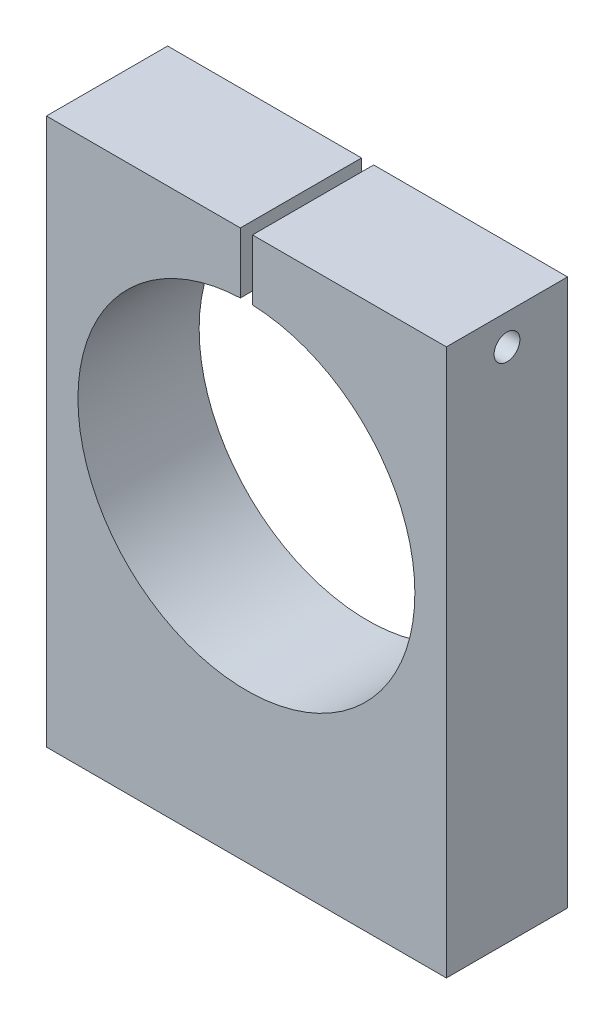
ISO-10303-21;
HEADER;
FILE_DESCRIPTION(('STEP AP214'),'2;1');
FILE_NAME('part.step','',(''),(''),'','','');
FILE_SCHEMA(('AUTOMOTIVE_DESIGN { 1 0 10303 214 1 1 1 1 }'));
ENDSEC;
DATA;
#1=APPLICATION_CONTEXT('core data for automotive mechanical design processes');
#2=APPLICATION_PROTOCOL_DEFINITION('international standard','automotive_design',2000,#1);
#3=PRODUCT_CONTEXT('',#1,'mechanical');
#4=PRODUCT('Part','Part','',(#3));
#5=PRODUCT_RELATED_PRODUCT_CATEGORY('part','',(#4));
#6=PRODUCT_DEFINITION_FORMATION('','',#4);
#7=PRODUCT_DEFINITION_CONTEXT('part definition',#1,'design');
#8=PRODUCT_DEFINITION('design','',#6,#7);
#9=PRODUCT_DEFINITION_SHAPE('','',#8);
#10=(LENGTH_UNIT() NAMED_UNIT(*) SI_UNIT(.MILLI.,.METRE.));
#11=(NAMED_UNIT(*) PLANE_ANGLE_UNIT() SI_UNIT($,.RADIAN.));
#12=(NAMED_UNIT(*) SI_UNIT($,.STERADIAN.) SOLID_ANGLE_UNIT());
#13=UNCERTAINTY_MEASURE_WITH_UNIT(LENGTH_MEASURE(1.E-05),#10,'distance_accuracy_value','');
#14=(GEOMETRIC_REPRESENTATION_CONTEXT(3) GLOBAL_UNCERTAINTY_ASSIGNED_CONTEXT((#13)) GLOBAL_UNIT_ASSIGNED_CONTEXT((#10,
#11,#12)) REPRESENTATION_CONTEXT('',''));
#15=CARTESIAN_POINT('',(0.,0.,0.));
#16=DIRECTION('',(0.,0.,1.));
#17=DIRECTION('',(1.,0.,0.));
#18=AXIS2_PLACEMENT_3D('',#15,#16,#17);
#19=CARTESIAN_POINT('',(-20.955,57.2769999999999,6.35));
#20=DIRECTION('',(0.,-1.,0.));
#21=DIRECTION('',(1.,0.,0.));
#22=AXIS2_PLACEMENT_3D('',#19,#20,#21);
#23=PLANE('',#22);
#24=DIRECTION('',(-1.,0.,0.));
#25=VECTOR('',#24,1.);
#26=CARTESIAN_POINT('',(-20.955,57.2769999999999,6.35));
#27=LINE('',#26,#25);
#28=CARTESIAN_POINT('',(-0.635000000000009,57.277,6.35));
#29=VERTEX_POINT('',#28);
#30=CARTESIAN_POINT('',(-20.955,57.2769999999999,6.35));
#31=VERTEX_POINT('',#30);
#32=EDGE_CURVE('E168',#29,#31,#27,.T.);
#33=ORIENTED_EDGE('',*,*,#32,.F.);
#34=DIRECTION('',(0.,0.,1.));
#35=VECTOR('',#34,1.);
#36=CARTESIAN_POINT('',(-0.635000000000009,57.277,-6.35));
#37=LINE('',#36,#35);
#38=CARTESIAN_POINT('',(-0.635000000000009,57.277,-6.35));
#39=VERTEX_POINT('',#38);
#40=EDGE_CURVE('E140',#39,#29,#37,.T.);
#41=ORIENTED_EDGE('',*,*,#40,.F.);
#42=DIRECTION('',(-1.,0.,0.));
#43=VECTOR('',#42,1.);
#44=CARTESIAN_POINT('',(-20.955,57.2769999999999,-6.35));
#45=LINE('',#44,#43);
#46=CARTESIAN_POINT('',(-20.955,57.2769999999999,-6.35));
#47=VERTEX_POINT('',#46);
#48=EDGE_CURVE('E179',#39,#47,#45,.T.);
#49=ORIENTED_EDGE('',*,*,#48,.T.);
#50=DIRECTION('',(0.,0.,-1.));
#51=VECTOR('',#50,1.);
#52=CARTESIAN_POINT('',(-20.955,57.2769999999999,6.35));
#53=LINE('',#52,#51);
#54=EDGE_CURVE('E172',#31,#47,#53,.T.);
#55=ORIENTED_EDGE('',*,*,#54,.F.);
#56=EDGE_LOOP('',(#33,#41,#49,#55));
#57=FACE_BOUND('',#56,.T.);
#58=ADVANCED_FACE('F37',(#57),#23,.F.);
#59=CARTESIAN_POINT('',(-20.955,57.2769999999999,6.35));
#60=DIRECTION('',(0.,0.,-1.));
#61=DIRECTION('',(-1.,0.,0.));
#62=AXIS2_PLACEMENT_3D('',#59,#60,#61);
#63=PLANE('',#62);
#64=CARTESIAN_POINT('',(0.,33.2739999999999,6.35));
#65=DIRECTION('',(0.,0.,1.));
#66=DIRECTION('',(1.,0.,0.));
#67=AXIS2_PLACEMENT_3D('',#64,#65,#66);
#68=CIRCLE('',#67,17.653);
#69=CARTESIAN_POINT('',(-0.635000000000009,50.9155754398522,6.35));
#70=VERTEX_POINT('',#69);
#71=CARTESIAN_POINT('',(0.634999999999991,50.9155754398522,6.35));
#72=VERTEX_POINT('',#71);
#73=EDGE_CURVE('E154',#70,#72,#68,.T.);
#74=ORIENTED_EDGE('',*,*,#73,.F.);
#75=DIRECTION('',(0.,1.,0.));
#76=VECTOR('',#75,1.);
#77=CARTESIAN_POINT('',(-0.635000000000009,-0.001000000000001,6.35));
#78=LINE('',#77,#76);
#79=EDGE_CURVE('E60',#70,#29,#78,.T.);
#80=ORIENTED_EDGE('',*,*,#79,.T.);
#81=ORIENTED_EDGE('',*,*,#32,.T.);
#82=DIRECTION('',(0.,-1.,0.));
#83=VECTOR('',#82,1.);
#84=CARTESIAN_POINT('',(-20.955,0.,6.35));
#85=LINE('',#84,#83);
#86=CARTESIAN_POINT('',(-20.955,0.,6.35));
#87=VERTEX_POINT('',#86);
#88=EDGE_CURVE('E160',#31,#87,#85,.T.);
#89=ORIENTED_EDGE('',*,*,#88,.T.);
#90=DIRECTION('',(1.,0.,0.));
#91=VECTOR('',#90,1.);
#92=CARTESIAN_POINT('',(-20.955,0.,6.35));
#93=LINE('',#92,#91);
#94=CARTESIAN_POINT('',(20.955,0.,6.35));
#95=VERTEX_POINT('',#94);
#96=EDGE_CURVE('E163',#87,#95,#93,.T.);
#97=ORIENTED_EDGE('',*,*,#96,.T.);
#98=DIRECTION('',(0.,1.,0.));
#99=VECTOR('',#98,1.);
#100=CARTESIAN_POINT('',(20.955,0.,6.35));
#101=LINE('',#100,#99);
#102=CARTESIAN_POINT('',(20.955,57.277,6.35));
#103=VERTEX_POINT('',#102);
#104=EDGE_CURVE('E166',#95,#103,#101,.T.);
#105=ORIENTED_EDGE('',*,*,#104,.T.);
#106=CARTESIAN_POINT('',(0.634999999999991,57.277,6.35));
#107=VERTEX_POINT('',#106);
#108=EDGE_CURVE('E169',#103,#107,#27,.T.);
#109=ORIENTED_EDGE('',*,*,#108,.T.);
#110=DIRECTION('',(0.,1.,0.));
#111=VECTOR('',#110,1.);
#112=CARTESIAN_POINT('',(0.634999999999991,-0.001000000000001,6.35));
#113=LINE('',#112,#111);
#114=EDGE_CURVE('E146',#72,#107,#113,.T.);
#115=ORIENTED_EDGE('',*,*,#114,.F.);
#116=EDGE_LOOP('',(#74,#80,#81,#89,#97,#105,#109,#115));
#117=FACE_BOUND('',#116,.T.);
#118=ADVANCED_FACE('F206',(#117),#63,.F.);
#119=CARTESIAN_POINT('',(-20.955,57.2769999999999,-6.35));
#120=DIRECTION('',(0.,0.,-1.));
#121=DIRECTION('',(-1.,0.,0.));
#122=AXIS2_PLACEMENT_3D('',#119,#120,#121);
#123=PLANE('',#122);
#124=DIRECTION('',(0.,1.,0.));
#125=VECTOR('',#124,1.);
#126=CARTESIAN_POINT('',(-0.635000000000009,-0.001000000000001,-6.35));
#127=LINE('',#126,#125);
#128=CARTESIAN_POINT('',(-0.635000000000009,50.9155754398522,-6.35));
#129=VERTEX_POINT('',#128);
#130=EDGE_CURVE('E142',#129,#39,#127,.T.);
#131=ORIENTED_EDGE('',*,*,#130,.F.);
#132=CARTESIAN_POINT('',(0.,33.2739999999999,-6.35));
#133=DIRECTION('',(0.,0.,1.));
#134=DIRECTION('',(1.,0.,0.));
#135=AXIS2_PLACEMENT_3D('',#132,#133,#134);
#136=CIRCLE('',#135,17.653);
#137=CARTESIAN_POINT('',(0.634999999999991,50.9155754398522,-6.35));
#138=VERTEX_POINT('',#137);
#139=EDGE_CURVE('E150',#129,#138,#136,.T.);
#140=ORIENTED_EDGE('',*,*,#139,.T.);
#141=DIRECTION('',(0.,1.,0.));
#142=VECTOR('',#141,1.);
#143=CARTESIAN_POINT('',(0.634999999999991,-0.001000000000001,-6.35));
#144=LINE('',#143,#142);
#145=CARTESIAN_POINT('',(0.634999999999991,57.277,-6.35));
#146=VERTEX_POINT('',#145);
#147=EDGE_CURVE('E52',#138,#146,#144,.T.);
#148=ORIENTED_EDGE('',*,*,#147,.T.);
#149=CARTESIAN_POINT('',(20.955,57.277,-6.35));
#150=VERTEX_POINT('',#149);
#151=EDGE_CURVE('E164',#150,#146,#45,.T.);
#152=ORIENTED_EDGE('',*,*,#151,.F.);
#153=DIRECTION('',(0.,1.,0.));
#154=VECTOR('',#153,1.);
#155=CARTESIAN_POINT('',(20.955,0.,-6.35));
#156=LINE('',#155,#154);
#157=CARTESIAN_POINT('',(20.955,0.,-6.35));
#158=VERTEX_POINT('',#157);
#159=EDGE_CURVE('E177',#158,#150,#156,.T.);
#160=ORIENTED_EDGE('',*,*,#159,.F.);
#161=DIRECTION('',(1.,0.,0.));
#162=VECTOR('',#161,1.);
#163=CARTESIAN_POINT('',(-20.955,0.,-6.35));
#164=LINE('',#163,#162);
#165=CARTESIAN_POINT('',(-20.955,0.,-6.35));
#166=VERTEX_POINT('',#165);
#167=EDGE_CURVE('E175',#166,#158,#164,.T.);
#168=ORIENTED_EDGE('',*,*,#167,.F.);
#169=DIRECTION('',(0.,-1.,0.));
#170=VECTOR('',#169,1.);
#171=CARTESIAN_POINT('',(-20.955,0.,-6.35));
#172=LINE('',#171,#170);
#173=EDGE_CURVE('E157',#47,#166,#172,.T.);
#174=ORIENTED_EDGE('',*,*,#173,.F.);
#175=ORIENTED_EDGE('',*,*,#48,.F.);
#176=EDGE_LOOP('',(#131,#140,#148,#152,#160,#168,#174,#175));
#177=FACE_BOUND('',#176,.T.);
#178=ADVANCED_FACE('F197',(#177),#123,.T.);
#179=CARTESIAN_POINT('',(-20.955,0.,6.35));
#180=DIRECTION('',(1.,0.,0.));
#181=DIRECTION('',(0.,1.,0.));
#182=AXIS2_PLACEMENT_3D('',#179,#180,#181);
#183=PLANE('',#182);
#184=CARTESIAN_POINT('',(-20.955,54.0962877199261,0.));
#185=DIRECTION('',(-1.,0.,0.));
#186=DIRECTION('',(0.,-1.,0.));
#187=AXIS2_PLACEMENT_3D('',#184,#185,#186);
#188=CIRCLE('',#187,1.7859375);
#189=CARTESIAN_POINT('',(-20.955,52.3103502199261,0.));
#190=VERTEX_POINT('',#189);
#191=EDGE_CURVE('E133',#190,#190,#188,.T.);
#192=ORIENTED_EDGE('',*,*,#191,.F.);
#193=EDGE_LOOP('',(#192));
#194=FACE_BOUND('',#193,.T.);
#195=ORIENTED_EDGE('',*,*,#173,.T.);
#196=DIRECTION('',(0.,0.,-1.));
#197=VECTOR('',#196,1.);
#198=CARTESIAN_POINT('',(-20.955,0.,6.35));
#199=LINE('',#198,#197);
#200=EDGE_CURVE('E11',#87,#166,#199,.T.);
#201=ORIENTED_EDGE('',*,*,#200,.F.);
#202=ORIENTED_EDGE('',*,*,#88,.F.);
#203=ORIENTED_EDGE('',*,*,#54,.T.);
#204=EDGE_LOOP('',(#195,#201,#202,#203));
#205=FACE_BOUND('',#204,.T.);
#206=ADVANCED_FACE('F39',(#194,#205),#183,.F.);
#207=CARTESIAN_POINT('',(-20.955,0.,6.35));
#208=DIRECTION('',(0.,1.,0.));
#209=DIRECTION('',(-1.,0.,0.));
#210=AXIS2_PLACEMENT_3D('',#207,#208,#209);
#211=PLANE('',#210);
#212=CARTESIAN_POINT('',(-14.605,0.,0.));
#213=DIRECTION('',(0.,-1.,0.));
#214=DIRECTION('',(0.,0.,-1.));
#215=AXIS2_PLACEMENT_3D('',#212,#213,#214);
#216=CIRCLE('',#215,1.13029999999999);
#217=CARTESIAN_POINT('',(-14.605,0.,-1.13029999999999));
#218=VERTEX_POINT('',#217);
#219=EDGE_CURVE('E117',#218,#218,#216,.T.);
#220=ORIENTED_EDGE('',*,*,#219,.F.);
#221=EDGE_LOOP('',(#220));
#222=FACE_BOUND('',#221,.T.);
#223=CARTESIAN_POINT('',(14.605,0.,0.));
#224=DIRECTION('',(0.,-1.,0.));
#225=DIRECTION('',(0.,0.,-1.));
#226=AXIS2_PLACEMENT_3D('',#223,#224,#225);
#227=CIRCLE('',#226,1.13029999999999);
#228=CARTESIAN_POINT('',(14.605,0.,-1.13029999999999));
#229=VERTEX_POINT('',#228);
#230=EDGE_CURVE('E116',#229,#229,#227,.T.);
#231=ORIENTED_EDGE('',*,*,#230,.F.);
#232=EDGE_LOOP('',(#231));
#233=FACE_BOUND('',#232,.T.);
#234=ORIENTED_EDGE('',*,*,#167,.T.);
#235=DIRECTION('',(0.,0.,-1.));
#236=VECTOR('',#235,1.);
#237=CARTESIAN_POINT('',(20.955,0.,6.35));
#238=LINE('',#237,#236);
#239=EDGE_CURVE('E45',#95,#158,#238,.T.);
#240=ORIENTED_EDGE('',*,*,#239,.F.);
#241=ORIENTED_EDGE('',*,*,#96,.F.);
#242=ORIENTED_EDGE('',*,*,#200,.T.);
#243=EDGE_LOOP('',(#234,#240,#241,#242));
#244=FACE_BOUND('',#243,.T.);
#245=ADVANCED_FACE('F209',(#222,#233,#244),#211,.F.);
#246=CARTESIAN_POINT('',(20.955,0.,6.35));
#247=DIRECTION('',(-1.,0.,0.));
#248=DIRECTION('',(0.,-1.,0.));
#249=AXIS2_PLACEMENT_3D('',#246,#247,#248);
#250=PLANE('',#249);
#251=CARTESIAN_POINT('',(20.955,54.0962877199261,0.));
#252=DIRECTION('',(-1.,0.,0.));
#253=DIRECTION('',(0.,0.,1.));
#254=AXIS2_PLACEMENT_3D('',#251,#252,#253);
#255=CIRCLE('',#254,1.35254999999999);
#256=CARTESIAN_POINT('',(20.955,54.0962877199261,1.35254999999999));
#257=VERTEX_POINT('',#256);
#258=EDGE_CURVE('E130',#257,#257,#255,.T.);
#259=ORIENTED_EDGE('',*,*,#258,.T.);
#260=EDGE_LOOP('',(#259));
#261=FACE_BOUND('',#260,.T.);
#262=ORIENTED_EDGE('',*,*,#159,.T.);
#263=DIRECTION('',(0.,0.,-1.));
#264=VECTOR('',#263,1.);
#265=CARTESIAN_POINT('',(20.955,57.277,6.35));
#266=LINE('',#265,#264);
#267=EDGE_CURVE('E184',#103,#150,#266,.T.);
#268=ORIENTED_EDGE('',*,*,#267,.F.);
#269=ORIENTED_EDGE('',*,*,#104,.F.);
#270=ORIENTED_EDGE('',*,*,#239,.T.);
#271=EDGE_LOOP('',(#262,#268,#269,#270));
#272=FACE_BOUND('',#271,.T.);
#273=ADVANCED_FACE('F191',(#261,#272),#250,.F.);
#274=ORIENTED_EDGE('',*,*,#151,.T.);
#275=DIRECTION('',(0.,0.,-1.));
#276=VECTOR('',#275,1.);
#277=CARTESIAN_POINT('',(0.634999999999991,57.277,-6.35));
#278=LINE('',#277,#276);
#279=EDGE_CURVE('E139',#107,#146,#278,.T.);
#280=ORIENTED_EDGE('',*,*,#279,.F.);
#281=ORIENTED_EDGE('',*,*,#108,.F.);
#282=ORIENTED_EDGE('',*,*,#267,.T.);
#283=EDGE_LOOP('',(#274,#280,#281,#282));
#284=FACE_BOUND('',#283,.T.);
#285=ADVANCED_FACE('F201',(#284),#23,.F.);
#286=CARTESIAN_POINT('',(0.,33.2739999999999,6.35));
#287=DIRECTION('',(0.,0.,-1.));
#288=DIRECTION('',(-1.,0.,0.));
#289=AXIS2_PLACEMENT_3D('',#286,#287,#288);
#290=CYLINDRICAL_SURFACE('',#289,17.653);
#291=DIRECTION('',(0.,0.,-1.));
#292=VECTOR('',#291,1.);
#293=CARTESIAN_POINT('',(-0.635000000000009,50.9155754398522,6.35));
#294=LINE('',#293,#292);
#295=EDGE_CURVE('E147',#129,#70,#294,.F.);
#296=ORIENTED_EDGE('',*,*,#295,.T.);
#297=ORIENTED_EDGE('',*,*,#73,.T.);
#298=DIRECTION('',(0.,0.,-1.));
#299=VECTOR('',#298,1.);
#300=CARTESIAN_POINT('',(0.634999999999991,50.9155754398522,6.35));
#301=LINE('',#300,#299);
#302=EDGE_CURVE('E144',#72,#138,#301,.T.);
#303=ORIENTED_EDGE('',*,*,#302,.T.);
#304=ORIENTED_EDGE('',*,*,#139,.F.);
#305=EDGE_LOOP('',(#296,#297,#303,#304));
#306=FACE_BOUND('',#305,.T.);
#307=ADVANCED_FACE('F219',(#306),#290,.F.);
#308=CARTESIAN_POINT('',(0.634999999999991,-0.001000000000001,-6.35));
#309=DIRECTION('',(1.,0.,0.));
#310=DIRECTION('',(0.,0.,-1.));
#311=AXIS2_PLACEMENT_3D('',#308,#309,#310);
#312=PLANE('',#311);
#313=CARTESIAN_POINT('',(0.634999999999991,54.0962877199261,0.));
#314=DIRECTION('',(-1.,0.,0.));
#315=DIRECTION('',(0.,0.,1.));
#316=AXIS2_PLACEMENT_3D('',#313,#314,#315);
#317=CIRCLE('',#316,1.35254999999999);
#318=CARTESIAN_POINT('',(0.634999999999991,54.0962877199261,1.35254999999999));
#319=VERTEX_POINT('',#318);
#320=EDGE_CURVE('E127',#319,#319,#317,.T.);
#321=ORIENTED_EDGE('',*,*,#320,.F.);
#322=EDGE_LOOP('',(#321));
#323=FACE_BOUND('',#322,.T.);
#324=ORIENTED_EDGE('',*,*,#114,.T.);
#325=ORIENTED_EDGE('',*,*,#279,.T.);
#326=ORIENTED_EDGE('',*,*,#147,.F.);
#327=ORIENTED_EDGE('',*,*,#302,.F.);
#328=EDGE_LOOP('',(#324,#325,#326,#327));
#329=FACE_BOUND('',#328,.T.);
#330=ADVANCED_FACE('F220',(#323,#329),#312,.F.);
#331=CARTESIAN_POINT('',(-0.635000000000009,-0.001000000000001,-6.35));
#332=DIRECTION('',(-1.,0.,0.));
#333=DIRECTION('',(0.,0.,1.));
#334=AXIS2_PLACEMENT_3D('',#331,#332,#333);
#335=PLANE('',#334);
#336=CARTESIAN_POINT('',(-0.63500000000001,54.0962877199261,0.));
#337=DIRECTION('',(-1.,0.,0.));
#338=DIRECTION('',(0.,0.,1.));
#339=AXIS2_PLACEMENT_3D('',#336,#337,#338);
#340=CIRCLE('',#339,1.7859375);
#341=CARTESIAN_POINT('',(-0.63500000000001,54.0962877199261,1.7859375));
#342=VERTEX_POINT('',#341);
#343=EDGE_CURVE('E136',#342,#342,#340,.F.);
#344=ORIENTED_EDGE('',*,*,#343,.F.);
#345=EDGE_LOOP('',(#344));
#346=FACE_BOUND('',#345,.T.);
#347=ORIENTED_EDGE('',*,*,#130,.T.);
#348=ORIENTED_EDGE('',*,*,#40,.T.);
#349=ORIENTED_EDGE('',*,*,#79,.F.);
#350=ORIENTED_EDGE('',*,*,#295,.F.);
#351=EDGE_LOOP('',(#347,#348,#349,#350));
#352=FACE_BOUND('',#351,.T.);
#353=ADVANCED_FACE('F217',(#346,#352),#335,.F.);
#354=CARTESIAN_POINT('',(4.41639406810139,54.0962877199261,0.));
#355=DIRECTION('',(-1.,0.,0.));
#356=DIRECTION('',(0.,-1.,0.));
#357=AXIS2_PLACEMENT_3D('',#354,#355,#356);
#358=CYLINDRICAL_SURFACE('',#357,1.7859375);
#359=ORIENTED_EDGE('',*,*,#343,.T.);
#360=EDGE_LOOP('',(#359));
#361=FACE_BOUND('',#360,.T.);
#362=ORIENTED_EDGE('',*,*,#191,.T.);
#363=EDGE_LOOP('',(#362));
#364=FACE_BOUND('',#363,.T.);
#365=ADVANCED_FACE('F228',(#361,#364),#358,.F.);
#366=CARTESIAN_POINT('',(0.634999999999991,54.0962877199261,0.));
#367=DIRECTION('',(-1.,0.,0.));
#368=DIRECTION('',(0.,0.,1.));
#369=AXIS2_PLACEMENT_3D('',#366,#367,#368);
#370=CYLINDRICAL_SURFACE('',#369,1.35254999999999);
#371=ORIENTED_EDGE('',*,*,#258,.F.);
#372=EDGE_LOOP('',(#371));
#373=FACE_BOUND('',#372,.T.);
#374=ORIENTED_EDGE('',*,*,#320,.T.);
#375=EDGE_LOOP('',(#374));
#376=FACE_BOUND('',#375,.T.);
#377=ADVANCED_FACE('F252',(#373,#376),#370,.F.);
#378=CARTESIAN_POINT('',(14.605,12.7,0.));
#379=DIRECTION('',(0.,-1.,0.));
#380=DIRECTION('',(0.,0.,-1.));
#381=AXIS2_PLACEMENT_3D('',#378,#379,#380);
#382=CONICAL_SURFACE('',#381,1.1303,1.02974425867665);
#383=CARTESIAN_POINT('',(14.605,13.3791527576869,0.));
#384=VERTEX_POINT('',#383);
#385=VERTEX_LOOP('',#384);
#386=FACE_BOUND('',#385,.T.);
#387=CARTESIAN_POINT('',(14.605,12.7,0.));
#388=DIRECTION('',(0.,-1.,0.));
#389=DIRECTION('',(0.,0.,-1.));
#390=AXIS2_PLACEMENT_3D('',#387,#388,#389);
#391=CIRCLE('',#390,1.1303);
#392=CARTESIAN_POINT('',(14.605,12.7,-1.1303));
#393=VERTEX_POINT('',#392);
#394=EDGE_CURVE('E120',#393,#393,#391,.T.);
#395=ORIENTED_EDGE('',*,*,#394,.T.);
#396=EDGE_LOOP('',(#395));
#397=FACE_BOUND('',#396,.T.);
#398=ADVANCED_FACE('F255',(#386,#397),#382,.F.);
#399=CARTESIAN_POINT('',(14.605,0.,0.));
#400=DIRECTION('',(0.,-1.,0.));
#401=DIRECTION('',(0.,0.,-1.));
#402=AXIS2_PLACEMENT_3D('',#399,#400,#401);
#403=CYLINDRICAL_SURFACE('',#402,1.13029999999999);
#404=ORIENTED_EDGE('',*,*,#394,.F.);
#405=EDGE_LOOP('',(#404));
#406=FACE_BOUND('',#405,.T.);
#407=ORIENTED_EDGE('',*,*,#230,.T.);
#408=EDGE_LOOP('',(#407));
#409=FACE_BOUND('',#408,.T.);
#410=ADVANCED_FACE('F110',(#406,#409),#403,.F.);
#411=CARTESIAN_POINT('',(-14.605,12.7,0.));
#412=DIRECTION('',(0.,-1.,0.));
#413=DIRECTION('',(0.,0.,-1.));
#414=AXIS2_PLACEMENT_3D('',#411,#412,#413);
#415=CONICAL_SURFACE('',#414,1.1303,1.02974425867665);
#416=CARTESIAN_POINT('',(-14.605,13.3791527576869,0.));
#417=VERTEX_POINT('',#416);
#418=VERTEX_LOOP('',#417);
#419=FACE_BOUND('',#418,.T.);
#420=CARTESIAN_POINT('',(-14.605,12.7,0.));
#421=DIRECTION('',(0.,-1.,0.));
#422=DIRECTION('',(0.,0.,-1.));
#423=AXIS2_PLACEMENT_3D('',#420,#421,#422);
#424=CIRCLE('',#423,1.1303);
#425=CARTESIAN_POINT('',(-14.605,12.7,-1.1303));
#426=VERTEX_POINT('',#425);
#427=EDGE_CURVE('E114',#426,#426,#424,.T.);
#428=ORIENTED_EDGE('',*,*,#427,.T.);
#429=EDGE_LOOP('',(#428));
#430=FACE_BOUND('',#429,.T.);
#431=ADVANCED_FACE('F106',(#419,#430),#415,.F.);
#432=CARTESIAN_POINT('',(-14.605,0.,0.));
#433=DIRECTION('',(0.,-1.,0.));
#434=DIRECTION('',(0.,0.,-1.));
#435=AXIS2_PLACEMENT_3D('',#432,#433,#434);
#436=CYLINDRICAL_SURFACE('',#435,1.13029999999999);
#437=ORIENTED_EDGE('',*,*,#427,.F.);
#438=EDGE_LOOP('',(#437));
#439=FACE_BOUND('',#438,.T.);
#440=ORIENTED_EDGE('',*,*,#219,.T.);
#441=EDGE_LOOP('',(#440));
#442=FACE_BOUND('',#441,.T.);
#443=ADVANCED_FACE('F109',(#439,#442),#436,.F.);
#444=CLOSED_SHELL('',(#58,#118,#178,#206,#245,#273,#285,#307,#330,#353,#365,#377,#398,#410,#431,#443));
#445=MANIFOLD_SOLID_BREP('B2',#444);
#446=ADVANCED_BREP_SHAPE_REPRESENTATION('',(#18,#445),#14);
#447=SHAPE_DEFINITION_REPRESENTATION(#9,#446);
ENDSEC;
END-ISO-10303-21;
